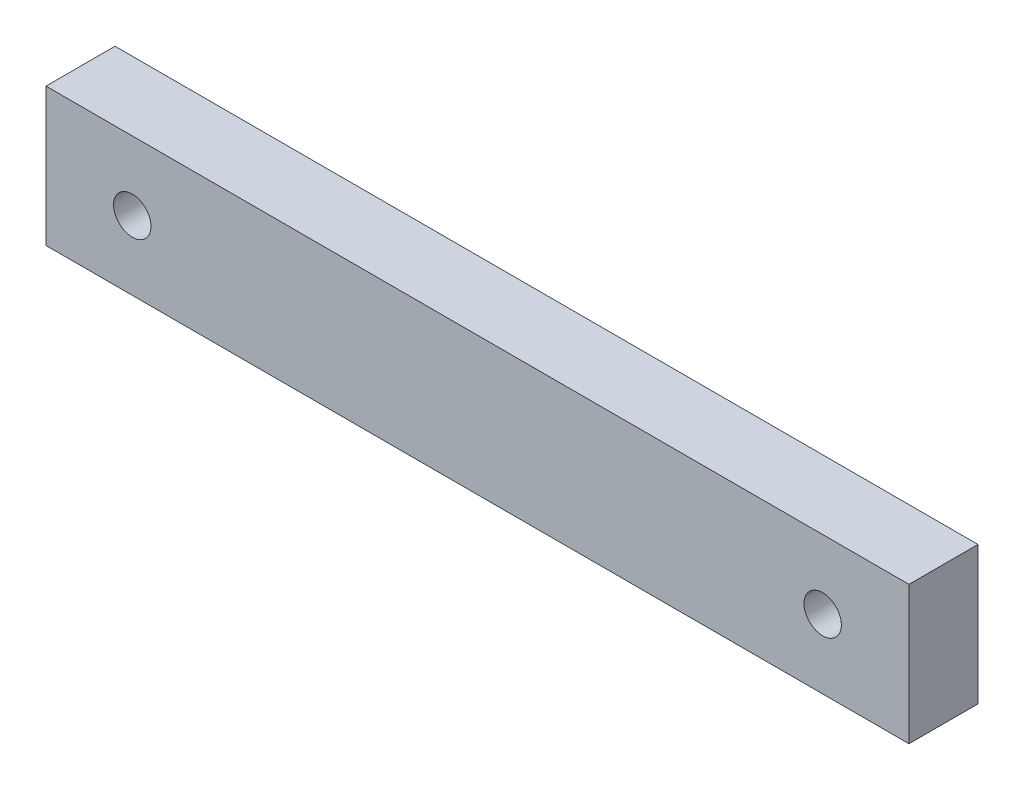
ISO-10303-21;
HEADER;
FILE_DESCRIPTION(('STEP AP214'),'2;1');
FILE_NAME('part.step','',(''),(''),'','','');
FILE_SCHEMA(('AUTOMOTIVE_DESIGN { 1 0 10303 214 1 1 1 1 }'));
ENDSEC;
DATA;
#1=APPLICATION_CONTEXT('core data for automotive mechanical design processes');
#2=APPLICATION_PROTOCOL_DEFINITION('international standard','automotive_design',2000,#1);
#3=PRODUCT_CONTEXT('',#1,'mechanical');
#4=PRODUCT('Part','Part','',(#3));
#5=PRODUCT_RELATED_PRODUCT_CATEGORY('part','',(#4));
#6=PRODUCT_DEFINITION_FORMATION('','',#4);
#7=PRODUCT_DEFINITION_CONTEXT('part definition',#1,'design');
#8=PRODUCT_DEFINITION('design','',#6,#7);
#9=PRODUCT_DEFINITION_SHAPE('','',#8);
#10=(LENGTH_UNIT() NAMED_UNIT(*) SI_UNIT(.MILLI.,.METRE.));
#11=(NAMED_UNIT(*) PLANE_ANGLE_UNIT() SI_UNIT($,.RADIAN.));
#12=(NAMED_UNIT(*) SI_UNIT($,.STERADIAN.) SOLID_ANGLE_UNIT());
#13=UNCERTAINTY_MEASURE_WITH_UNIT(LENGTH_MEASURE(1.E-05),#10,'distance_accuracy_value','');
#14=(GEOMETRIC_REPRESENTATION_CONTEXT(3) GLOBAL_UNCERTAINTY_ASSIGNED_CONTEXT((#13)) GLOBAL_UNIT_ASSIGNED_CONTEXT((#10,
#11,#12)) REPRESENTATION_CONTEXT('',''));
#15=CARTESIAN_POINT('',(0.,0.,0.));
#16=DIRECTION('',(0.,0.,1.));
#17=DIRECTION('',(1.,0.,0.));
#18=AXIS2_PLACEMENT_3D('',#15,#16,#17);
#19=CARTESIAN_POINT('',(75.,-12.,6.));
#20=DIRECTION('',(-1.,0.,0.));
#21=DIRECTION('',(0.,0.,1.));
#22=AXIS2_PLACEMENT_3D('',#19,#20,#21);
#23=PLANE('',#22);
#24=DIRECTION('',(0.,1.,0.));
#25=VECTOR('',#24,1.);
#26=CARTESIAN_POINT('',(75.,-12.,-6.));
#27=LINE('',#26,#25);
#28=CARTESIAN_POINT('',(75.,-12.,-6.));
#29=VERTEX_POINT('',#28);
#30=CARTESIAN_POINT('',(75.,12.,-6.));
#31=VERTEX_POINT('',#30);
#32=EDGE_CURVE('E107',#29,#31,#27,.T.);
#33=ORIENTED_EDGE('',*,*,#32,.T.);
#34=DIRECTION('',(0.,0.,-1.));
#35=VECTOR('',#34,1.);
#36=CARTESIAN_POINT('',(75.,12.,6.));
#37=LINE('',#36,#35);
#38=CARTESIAN_POINT('',(75.,12.,6.));
#39=VERTEX_POINT('',#38);
#40=EDGE_CURVE('E11',#39,#31,#37,.T.);
#41=ORIENTED_EDGE('',*,*,#40,.F.);
#42=DIRECTION('',(0.,1.,0.));
#43=VECTOR('',#42,1.);
#44=CARTESIAN_POINT('',(75.,-12.,6.));
#45=LINE('',#44,#43);
#46=CARTESIAN_POINT('',(75.,-12.,6.));
#47=VERTEX_POINT('',#46);
#48=EDGE_CURVE('E91',#47,#39,#45,.T.);
#49=ORIENTED_EDGE('',*,*,#48,.F.);
#50=DIRECTION('',(0.,0.,-1.));
#51=VECTOR('',#50,1.);
#52=CARTESIAN_POINT('',(75.,-12.,6.));
#53=LINE('',#52,#51);
#54=EDGE_CURVE('E103',#47,#29,#53,.T.);
#55=ORIENTED_EDGE('',*,*,#54,.T.);
#56=EDGE_LOOP('',(#33,#41,#49,#55));
#57=FACE_BOUND('',#56,.T.);
#58=ADVANCED_FACE('F39',(#57),#23,.F.);
#59=CARTESIAN_POINT('',(-75.,12.,6.));
#60=DIRECTION('',(0.,-1.,0.));
#61=DIRECTION('',(0.,0.,-1.));
#62=AXIS2_PLACEMENT_3D('',#59,#60,#61);
#63=PLANE('',#62);
#64=DIRECTION('',(-1.,0.,0.));
#65=VECTOR('',#64,1.);
#66=CARTESIAN_POINT('',(-75.,12.,-6.));
#67=LINE('',#66,#65);
#68=CARTESIAN_POINT('',(-75.,12.,-6.));
#69=VERTEX_POINT('',#68);
#70=EDGE_CURVE('E96',#31,#69,#67,.T.);
#71=ORIENTED_EDGE('',*,*,#70,.T.);
#72=DIRECTION('',(0.,0.,-1.));
#73=VECTOR('',#72,1.);
#74=CARTESIAN_POINT('',(-75.,12.,6.));
#75=LINE('',#74,#73);
#76=CARTESIAN_POINT('',(-75.,12.,6.));
#77=VERTEX_POINT('',#76);
#78=EDGE_CURVE('E48',#77,#69,#75,.T.);
#79=ORIENTED_EDGE('',*,*,#78,.F.);
#80=DIRECTION('',(-1.,0.,0.));
#81=VECTOR('',#80,1.);
#82=CARTESIAN_POINT('',(-75.,12.,6.));
#83=LINE('',#82,#81);
#84=EDGE_CURVE('E86',#39,#77,#83,.T.);
#85=ORIENTED_EDGE('',*,*,#84,.F.);
#86=ORIENTED_EDGE('',*,*,#40,.T.);
#87=EDGE_LOOP('',(#71,#79,#85,#86));
#88=FACE_BOUND('',#87,.T.);
#89=ADVANCED_FACE('F95',(#88),#63,.F.);
#90=CARTESIAN_POINT('',(-75.,-12.,6.));
#91=DIRECTION('',(1.,0.,0.));
#92=DIRECTION('',(0.,0.,-1.));
#93=AXIS2_PLACEMENT_3D('',#90,#91,#92);
#94=PLANE('',#93);
#95=DIRECTION('',(0.,-1.,0.));
#96=VECTOR('',#95,1.);
#97=CARTESIAN_POINT('',(-75.,-12.,-6.));
#98=LINE('',#97,#96);
#99=CARTESIAN_POINT('',(-75.,-12.,-6.));
#100=VERTEX_POINT('',#99);
#101=EDGE_CURVE('E73',#69,#100,#98,.T.);
#102=ORIENTED_EDGE('',*,*,#101,.T.);
#103=DIRECTION('',(0.,0.,-1.));
#104=VECTOR('',#103,1.);
#105=CARTESIAN_POINT('',(-75.,-12.,6.));
#106=LINE('',#105,#104);
#107=CARTESIAN_POINT('',(-75.,-12.,6.));
#108=VERTEX_POINT('',#107);
#109=EDGE_CURVE('E98',#108,#100,#106,.T.);
#110=ORIENTED_EDGE('',*,*,#109,.F.);
#111=DIRECTION('',(0.,-1.,0.));
#112=VECTOR('',#111,1.);
#113=CARTESIAN_POINT('',(-75.,-12.,6.));
#114=LINE('',#113,#112);
#115=EDGE_CURVE('E89',#77,#108,#114,.T.);
#116=ORIENTED_EDGE('',*,*,#115,.F.);
#117=ORIENTED_EDGE('',*,*,#78,.T.);
#118=EDGE_LOOP('',(#102,#110,#116,#117));
#119=FACE_BOUND('',#118,.T.);
#120=ADVANCED_FACE('F99',(#119),#94,.F.);
#121=CARTESIAN_POINT('',(-75.,-12.,6.));
#122=DIRECTION('',(0.,1.,0.));
#123=DIRECTION('',(0.,0.,1.));
#124=AXIS2_PLACEMENT_3D('',#121,#122,#123);
#125=PLANE('',#124);
#126=DIRECTION('',(1.,0.,0.));
#127=VECTOR('',#126,1.);
#128=CARTESIAN_POINT('',(-75.,-12.,-6.));
#129=LINE('',#128,#127);
#130=EDGE_CURVE('E79',#100,#29,#129,.T.);
#131=ORIENTED_EDGE('',*,*,#130,.T.);
#132=ORIENTED_EDGE('',*,*,#54,.F.);
#133=DIRECTION('',(1.,0.,0.));
#134=VECTOR('',#133,1.);
#135=CARTESIAN_POINT('',(-75.,-12.,6.));
#136=LINE('',#135,#134);
#137=EDGE_CURVE('E56',#108,#47,#136,.T.);
#138=ORIENTED_EDGE('',*,*,#137,.F.);
#139=ORIENTED_EDGE('',*,*,#109,.T.);
#140=EDGE_LOOP('',(#131,#132,#138,#139));
#141=FACE_BOUND('',#140,.T.);
#142=ADVANCED_FACE('F121',(#141),#125,.F.);
#143=CARTESIAN_POINT('',(0.,0.,6.));
#144=DIRECTION('',(0.,0.,-1.));
#145=DIRECTION('',(-1.,0.,0.));
#146=AXIS2_PLACEMENT_3D('',#143,#144,#145);
#147=PLANE('',#146);
#148=CARTESIAN_POINT('',(-60.,0.,6.));
#149=DIRECTION('',(0.,0.,-1.));
#150=DIRECTION('',(-1.,0.,0.));
#151=AXIS2_PLACEMENT_3D('',#148,#149,#150);
#152=CIRCLE('',#151,3.25);
#153=CARTESIAN_POINT('',(-63.25,0.,6.));
#154=VERTEX_POINT('',#153);
#155=EDGE_CURVE('E111',#154,#154,#152,.T.);
#156=ORIENTED_EDGE('',*,*,#155,.T.);
#157=EDGE_LOOP('',(#156));
#158=FACE_BOUND('',#157,.T.);
#159=CARTESIAN_POINT('',(60.,0.,6.));
#160=DIRECTION('',(0.,0.,-1.));
#161=DIRECTION('',(-1.,0.,0.));
#162=AXIS2_PLACEMENT_3D('',#159,#160,#161);
#163=CIRCLE('',#162,3.25000000000001);
#164=CARTESIAN_POINT('',(56.75,0.,6.));
#165=VERTEX_POINT('',#164);
#166=EDGE_CURVE('E131',#165,#165,#163,.T.);
#167=ORIENTED_EDGE('',*,*,#166,.T.);
#168=EDGE_LOOP('',(#167));
#169=FACE_BOUND('',#168,.T.);
#170=ORIENTED_EDGE('',*,*,#48,.T.);
#171=ORIENTED_EDGE('',*,*,#84,.T.);
#172=ORIENTED_EDGE('',*,*,#115,.T.);
#173=ORIENTED_EDGE('',*,*,#137,.T.);
#174=EDGE_LOOP('',(#170,#171,#172,#173));
#175=FACE_BOUND('',#174,.T.);
#176=ADVANCED_FACE('F87',(#158,#169,#175),#147,.F.);
#177=CARTESIAN_POINT('',(0.,0.,-6.));
#178=DIRECTION('',(0.,0.,-1.));
#179=DIRECTION('',(-1.,0.,0.));
#180=AXIS2_PLACEMENT_3D('',#177,#178,#179);
#181=PLANE('',#180);
#182=CARTESIAN_POINT('',(-60.,0.,-6.));
#183=DIRECTION('',(0.,0.,1.));
#184=DIRECTION('',(1.,0.,0.));
#185=AXIS2_PLACEMENT_3D('',#182,#183,#184);
#186=CIRCLE('',#185,3.25);
#187=CARTESIAN_POINT('',(-56.75,0.,-6.));
#188=VERTEX_POINT('',#187);
#189=EDGE_CURVE('E135',#188,#188,#186,.T.);
#190=ORIENTED_EDGE('',*,*,#189,.T.);
#191=EDGE_LOOP('',(#190));
#192=FACE_BOUND('',#191,.T.);
#193=CARTESIAN_POINT('',(60.,0.,-6.));
#194=DIRECTION('',(0.,0.,1.));
#195=DIRECTION('',(1.,0.,0.));
#196=AXIS2_PLACEMENT_3D('',#193,#194,#195);
#197=CIRCLE('',#196,3.25000000000001);
#198=CARTESIAN_POINT('',(63.25,0.,-6.));
#199=VERTEX_POINT('',#198);
#200=EDGE_CURVE('E136',#199,#199,#197,.T.);
#201=ORIENTED_EDGE('',*,*,#200,.T.);
#202=EDGE_LOOP('',(#201));
#203=FACE_BOUND('',#202,.T.);
#204=ORIENTED_EDGE('',*,*,#32,.F.);
#205=ORIENTED_EDGE('',*,*,#130,.F.);
#206=ORIENTED_EDGE('',*,*,#101,.F.);
#207=ORIENTED_EDGE('',*,*,#70,.F.);
#208=EDGE_LOOP('',(#204,#205,#206,#207));
#209=FACE_BOUND('',#208,.T.);
#210=ADVANCED_FACE('F124',(#192,#203,#209),#181,.T.);
#211=CARTESIAN_POINT('',(60.,0.,-6.));
#212=DIRECTION('',(0.,0.,1.));
#213=DIRECTION('',(1.,0.,0.));
#214=AXIS2_PLACEMENT_3D('',#211,#212,#213);
#215=CYLINDRICAL_SURFACE('',#214,3.25000000000001);
#216=ORIENTED_EDGE('',*,*,#200,.F.);
#217=EDGE_LOOP('',(#216));
#218=FACE_BOUND('',#217,.T.);
#219=ORIENTED_EDGE('',*,*,#166,.F.);
#220=EDGE_LOOP('',(#219));
#221=FACE_BOUND('',#220,.T.);
#222=ADVANCED_FACE('F149',(#218,#221),#215,.F.);
#223=CARTESIAN_POINT('',(-60.,0.,-6.));
#224=DIRECTION('',(0.,0.,1.));
#225=DIRECTION('',(1.,0.,0.));
#226=AXIS2_PLACEMENT_3D('',#223,#224,#225);
#227=CYLINDRICAL_SURFACE('',#226,3.25);
#228=ORIENTED_EDGE('',*,*,#189,.F.);
#229=EDGE_LOOP('',(#228));
#230=FACE_BOUND('',#229,.T.);
#231=ORIENTED_EDGE('',*,*,#155,.F.);
#232=EDGE_LOOP('',(#231));
#233=FACE_BOUND('',#232,.T.);
#234=ADVANCED_FACE('F146',(#230,#233),#227,.F.);
#235=CLOSED_SHELL('',(#58,#89,#120,#142,#176,#210,#222,#234));
#236=MANIFOLD_SOLID_BREP('B2',#235);
#237=ADVANCED_BREP_SHAPE_REPRESENTATION('',(#18,#236),#14);
#238=SHAPE_DEFINITION_REPRESENTATION(#9,#237);
ENDSEC;
END-ISO-10303-21;
